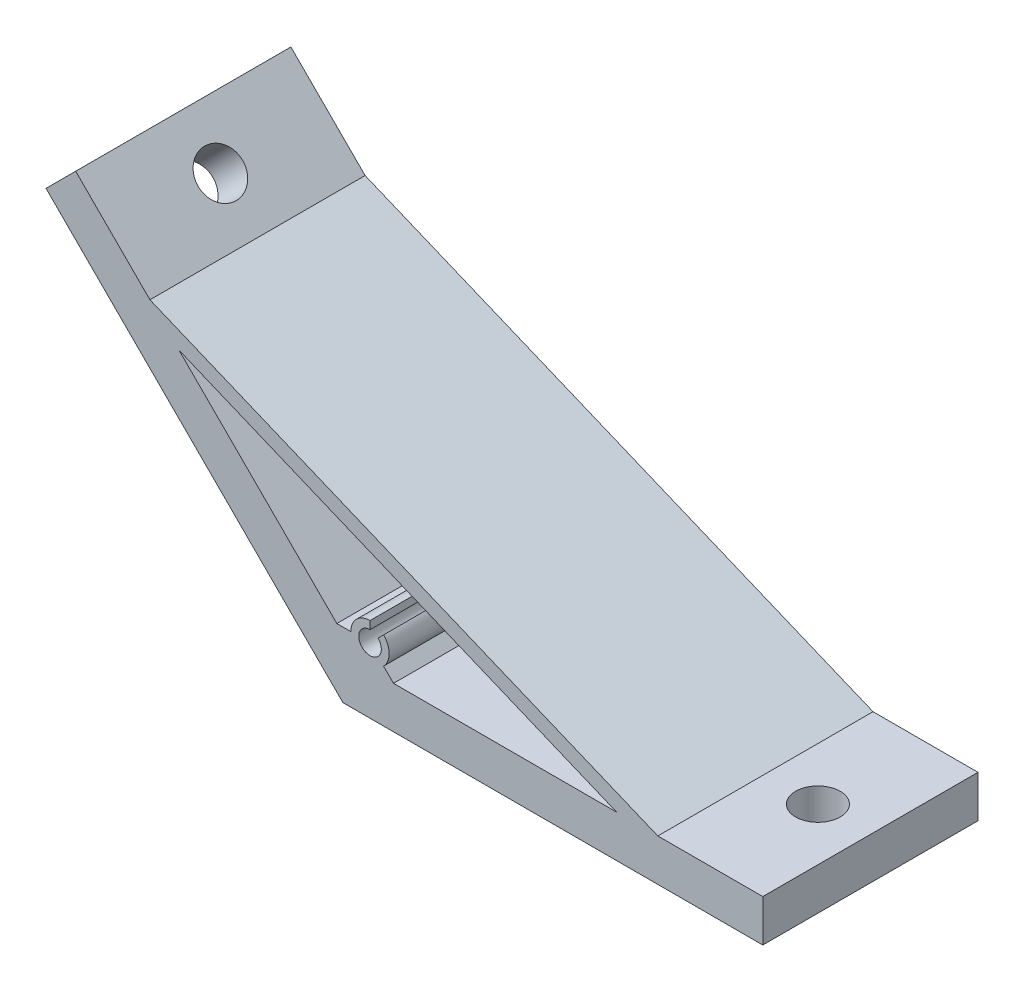
ISO-10303-21;
HEADER;
FILE_DESCRIPTION(('STEP AP214'),'2;1');
FILE_NAME('part.step','',(''),(''),'','','');
FILE_SCHEMA(('AUTOMOTIVE_DESIGN { 1 0 10303 214 1 1 1 1 }'));
ENDSEC;
DATA;
#1=APPLICATION_CONTEXT('core data for automotive mechanical design processes');
#2=APPLICATION_PROTOCOL_DEFINITION('international standard','automotive_design',2000,#1);
#3=PRODUCT_CONTEXT('',#1,'mechanical');
#4=PRODUCT('Part','Part','',(#3));
#5=PRODUCT_RELATED_PRODUCT_CATEGORY('part','',(#4));
#6=PRODUCT_DEFINITION_FORMATION('','',#4);
#7=PRODUCT_DEFINITION_CONTEXT('part definition',#1,'design');
#8=PRODUCT_DEFINITION('design','',#6,#7);
#9=PRODUCT_DEFINITION_SHAPE('','',#8);
#10=(LENGTH_UNIT() NAMED_UNIT(*) SI_UNIT(.MILLI.,.METRE.));
#11=(NAMED_UNIT(*) PLANE_ANGLE_UNIT() SI_UNIT($,.RADIAN.));
#12=(NAMED_UNIT(*) SI_UNIT($,.STERADIAN.) SOLID_ANGLE_UNIT());
#13=UNCERTAINTY_MEASURE_WITH_UNIT(LENGTH_MEASURE(1.E-05),#10,'distance_accuracy_value','');
#14=(GEOMETRIC_REPRESENTATION_CONTEXT(3) GLOBAL_UNCERTAINTY_ASSIGNED_CONTEXT((#13)) GLOBAL_UNIT_ASSIGNED_CONTEXT((#10,
#11,#12)) REPRESENTATION_CONTEXT('',''));
#15=CARTESIAN_POINT('',(0.,0.,0.));
#16=DIRECTION('',(0.,0.,1.));
#17=DIRECTION('',(1.,0.,0.));
#18=AXIS2_PLACEMENT_3D('',#15,#16,#17);
#19=CARTESIAN_POINT('',(-36.7695526216999,48.0832611206847,20.5));
#20=DIRECTION('',(-0.707106781186536,-0.707106781186559,0.));
#21=DIRECTION('',(0.707106781186559,-0.707106781186536,0.));
#22=AXIS2_PLACEMENT_3D('',#19,#20,#21);
#23=PLANE('',#22);
#24=DIRECTION('',(-0.707106781186559,0.707106781186536,0.));
#25=VECTOR('',#24,1.);
#26=CARTESIAN_POINT('',(-36.7695526216999,48.0832611206847,-20.5));
#27=LINE('',#26,#25);
#28=CARTESIAN_POINT('',(-36.7695526216999,48.0832611206847,-20.5));
#29=VERTEX_POINT('',#28);
#30=CARTESIAN_POINT('',(-50.9116882454318,62.2253967444162,-20.5));
#31=VERTEX_POINT('',#30);
#32=EDGE_CURVE('E259',#29,#31,#27,.T.);
#33=ORIENTED_EDGE('',*,*,#32,.T.);
#34=DIRECTION('',(0.,0.,-1.));
#35=VECTOR('',#34,1.);
#36=CARTESIAN_POINT('',(-50.9116882454318,62.2253967444162,20.5));
#37=LINE('',#36,#35);
#38=CARTESIAN_POINT('',(-50.9116882454318,62.2253967444162,20.5));
#39=VERTEX_POINT('',#38);
#40=EDGE_CURVE('E274',#39,#31,#37,.T.);
#41=ORIENTED_EDGE('',*,*,#40,.F.);
#42=DIRECTION('',(-0.707106781186559,0.707106781186536,0.));
#43=VECTOR('',#42,1.);
#44=CARTESIAN_POINT('',(-36.7695526216999,48.0832611206847,20.5));
#45=LINE('',#44,#43);
#46=CARTESIAN_POINT('',(-36.7695526216999,48.0832611206847,20.5));
#47=VERTEX_POINT('',#46);
#48=EDGE_CURVE('E244',#47,#39,#45,.T.);
#49=ORIENTED_EDGE('',*,*,#48,.F.);
#50=DIRECTION('',(0.,0.,-1.));
#51=VECTOR('',#50,1.);
#52=CARTESIAN_POINT('',(-36.7695526216999,48.0832611206847,20.5));
#53=LINE('',#52,#51);
#54=EDGE_CURVE('E277',#47,#29,#53,.T.);
#55=ORIENTED_EDGE('',*,*,#54,.T.);
#56=EDGE_LOOP('',(#33,#41,#49,#55));
#57=FACE_BOUND('',#56,.T.);
#58=CARTESIAN_POINT('',(-43.840620433566,55.1543289325507,0.));
#59=DIRECTION('',(-0.707106781186552,-0.707106781186543,0.));
#60=DIRECTION('',(0.707106781186543,-0.707106781186552,0.));
#61=AXIS2_PLACEMENT_3D('',#58,#59,#60);
#62=CIRCLE('',#61,4.25000000000001);
#63=CARTESIAN_POINT('',(-40.8354166135232,52.1491251125078,0.));
#64=VERTEX_POINT('',#63);
#65=EDGE_CURVE('E324',#64,#64,#62,.T.);
#66=ORIENTED_EDGE('',*,*,#65,.T.);
#67=EDGE_LOOP('',(#66));
#68=FACE_BOUND('',#67,.T.);
#69=ADVANCED_FACE('F34',(#57,#68),#23,.F.);
#70=CARTESIAN_POINT('',(0.,0.,20.5));
#71=DIRECTION('',(0.707106781186545,0.707106781186551,0.));
#72=DIRECTION('',(-0.70710678118655,0.707106781186545,0.));
#73=AXIS2_PLACEMENT_3D('',#70,#71,#72);
#74=PLANE('',#73);
#75=DIRECTION('',(0.70710678118655,-0.707106781186545,0.));
#76=VECTOR('',#75,1.);
#77=CARTESIAN_POINT('',(0.,0.,-20.5));
#78=LINE('',#77,#76);
#79=CARTESIAN_POINT('',(-56.5685424949243,56.5685424949238,-20.5));
#80=VERTEX_POINT('',#79);
#81=CARTESIAN_POINT('',(0.,0.,-20.5));
#82=VERTEX_POINT('',#81);
#83=EDGE_CURVE('E263',#80,#82,#78,.T.);
#84=ORIENTED_EDGE('',*,*,#83,.T.);
#85=DIRECTION('',(0.,0.,-1.));
#86=VECTOR('',#85,1.);
#87=CARTESIAN_POINT('',(0.,0.,20.5));
#88=LINE('',#87,#86);
#89=CARTESIAN_POINT('',(0.,0.,20.5));
#90=VERTEX_POINT('',#89);
#91=EDGE_CURVE('E268',#90,#82,#88,.T.);
#92=ORIENTED_EDGE('',*,*,#91,.F.);
#93=DIRECTION('',(0.70710678118655,-0.707106781186545,0.));
#94=VECTOR('',#93,1.);
#95=CARTESIAN_POINT('',(0.,0.,20.5));
#96=LINE('',#95,#94);
#97=CARTESIAN_POINT('',(-56.5685424949243,56.5685424949238,20.5));
#98=VERTEX_POINT('',#97);
#99=EDGE_CURVE('E248',#98,#90,#96,.T.);
#100=ORIENTED_EDGE('',*,*,#99,.F.);
#101=DIRECTION('',(0.,0.,-1.));
#102=VECTOR('',#101,1.);
#103=CARTESIAN_POINT('',(-56.5685424949243,56.5685424949238,20.5));
#104=LINE('',#103,#102);
#105=EDGE_CURVE('E271',#98,#80,#104,.T.);
#106=ORIENTED_EDGE('',*,*,#105,.T.);
#107=EDGE_LOOP('',(#84,#92,#100,#106));
#108=FACE_BOUND('',#107,.T.);
#109=CARTESIAN_POINT('',(-49.4974746830586,49.4974746830582,0.));
#110=DIRECTION('',(0.707106781186545,0.707106781186551,0.));
#111=DIRECTION('',(-0.70710678118655,0.707106781186545,0.));
#112=AXIS2_PLACEMENT_3D('',#109,#110,#111);
#113=CIRCLE('',#112,4.25000000000001);
#114=CARTESIAN_POINT('',(-52.5026785031014,52.502678503101,0.));
#115=VERTEX_POINT('',#114);
#116=EDGE_CURVE('E38',#115,#115,#113,.F.);
#117=ORIENTED_EDGE('',*,*,#116,.F.);
#118=EDGE_LOOP('',(#117));
#119=FACE_BOUND('',#118,.T.);
#120=ADVANCED_FACE('F316',(#108,#119),#74,.F.);
#121=CARTESIAN_POINT('',(0.,0.,20.5));
#122=DIRECTION('',(0.,0.,-1.));
#123=DIRECTION('',(-1.,0.,0.));
#124=AXIS2_PLACEMENT_3D('',#121,#122,#123);
#125=PLANE('',#124);
#126=DIRECTION('',(0.,1.,0.));
#127=VECTOR('',#126,1.);
#128=CARTESIAN_POINT('',(80.,8.,20.5));
#129=LINE('',#128,#127);
#130=CARTESIAN_POINT('',(80.,0.,20.5));
#131=VERTEX_POINT('',#130);
#132=CARTESIAN_POINT('',(80.,8.,20.5));
#133=VERTEX_POINT('',#132);
#134=EDGE_CURVE('E236',#131,#133,#129,.T.);
#135=ORIENTED_EDGE('',*,*,#134,.T.);
#136=DIRECTION('',(-1.,0.,0.));
#137=VECTOR('',#136,1.);
#138=CARTESIAN_POINT('',(80.,8.,20.5));
#139=LINE('',#138,#137);
#140=CARTESIAN_POINT('',(59.9999999999991,7.99999999999989,20.5));
#141=VERTEX_POINT('',#140);
#142=EDGE_CURVE('E239',#133,#141,#139,.T.);
#143=ORIENTED_EDGE('',*,*,#142,.T.);
#144=DIRECTION('',(-0.923879532511286,0.382683432365092,0.));
#145=VECTOR('',#144,1.);
#146=CARTESIAN_POINT('',(-36.7695526216999,48.0832611206847,20.5));
#147=LINE('',#146,#145);
#148=EDGE_CURVE('E242',#141,#47,#147,.T.);
#149=ORIENTED_EDGE('',*,*,#148,.T.);
#150=ORIENTED_EDGE('',*,*,#48,.T.);
#151=DIRECTION('',(-0.707106781186548,-0.707106781186548,0.));
#152=VECTOR('',#151,1.);
#153=CARTESIAN_POINT('',(-50.9116882454318,62.2253967444162,20.5));
#154=LINE('',#153,#152);
#155=EDGE_CURVE('E246',#39,#98,#154,.T.);
#156=ORIENTED_EDGE('',*,*,#155,.T.);
#157=ORIENTED_EDGE('',*,*,#99,.T.);
#158=DIRECTION('',(1.,0.,0.));
#159=VECTOR('',#158,1.);
#160=CARTESIAN_POINT('',(80.,0.,20.5));
#161=LINE('',#160,#159);
#162=EDGE_CURVE('E250',#90,#131,#161,.T.);
#163=ORIENTED_EDGE('',*,*,#162,.T.);
#164=EDGE_LOOP('',(#135,#143,#149,#150,#156,#157,#163));
#165=FACE_BOUND('',#164,.T.);
#166=DIRECTION('',(-0.92387953251129,0.382683432365082,0.));
#167=VECTOR('',#166,1.);
#168=CARTESIAN_POINT('',(-31.2262754266308,42.5399839256161,20.5));
#169=LINE('',#168,#167);
#170=CARTESIAN_POINT('',(52.1606222107425,7.99999999999989,20.5));
#171=VERTEX_POINT('',#170);
#172=CARTESIAN_POINT('',(-31.2262754266308,42.5399839256161,20.5));
#173=VERTEX_POINT('',#172);
#174=EDGE_CURVE('E154',#171,#173,#169,.T.);
#175=ORIENTED_EDGE('',*,*,#174,.F.);
#176=DIRECTION('',(1.,0.,0.));
#177=VECTOR('',#176,1.);
#178=CARTESIAN_POINT('',(52.1606222107425,7.99999999999989,20.5));
#179=LINE('',#178,#177);
#180=CARTESIAN_POINT('',(9.63860002583124,8.,20.5));
#181=VERTEX_POINT('',#180);
#182=EDGE_CURVE('E193',#181,#171,#179,.T.);
#183=ORIENTED_EDGE('',*,*,#182,.F.);
#184=DIRECTION('',(0.70710678118647,-0.707106781186625,0.));
#185=VECTOR('',#184,1.);
#186=CARTESIAN_POINT('',(9.63860002583124,8.,20.5));
#187=LINE('',#186,#185);
#188=CARTESIAN_POINT('',(7.74716608826006,9.89143393757159,20.5));
#189=VERTEX_POINT('',#188);
#190=EDGE_CURVE('E191',#189,#181,#187,.T.);
#191=ORIENTED_EDGE('',*,*,#190,.F.);
#192=CARTESIAN_POINT('',(5.16622633692896,12.4723736889023,20.5));
#193=DIRECTION('',(0.,0.,-1.));
#194=DIRECTION('',(1.,0.,0.));
#195=AXIS2_PLACEMENT_3D('',#192,#193,#194);
#196=CIRCLE('',#195,3.65);
#197=CARTESIAN_POINT('',(7.74716608826007,15.053313440233,20.5));
#198=VERTEX_POINT('',#197);
#199=EDGE_CURVE('E189',#198,#189,#196,.T.);
#200=ORIENTED_EDGE('',*,*,#199,.F.);
#201=DIRECTION('',(0.707106781186523,0.707106781186572,0.));
#202=VECTOR('',#201,1.);
#203=CARTESIAN_POINT('',(6.68650591648028,13.9926532684531,20.5));
#204=LINE('',#203,#202);
#205=CARTESIAN_POINT('',(6.68650591648028,13.9926532684531,20.5));
#206=VERTEX_POINT('',#205);
#207=EDGE_CURVE('E187',#206,#198,#204,.T.);
#208=ORIENTED_EDGE('',*,*,#207,.F.);
#209=CARTESIAN_POINT('',(5.16622633692896,12.4723736889023,20.5));
#210=DIRECTION('',(0.,0.,1.));
#211=DIRECTION('',(1.,0.,0.));
#212=AXIS2_PLACEMENT_3D('',#209,#210,#211);
#213=CIRCLE('',#212,2.15);
#214=CARTESIAN_POINT('',(5.16622633692896,14.6223736889023,20.5));
#215=VERTEX_POINT('',#214);
#216=EDGE_CURVE('E185',#215,#206,#213,.T.);
#217=ORIENTED_EDGE('',*,*,#216,.F.);
#218=DIRECTION('',(0.,-1.,0.));
#219=VECTOR('',#218,1.);
#220=CARTESIAN_POINT('',(5.16622633692896,14.6223736889023,20.5));
#221=LINE('',#220,#219);
#222=CARTESIAN_POINT('',(5.16622633692896,16.1223736889023,20.5));
#223=VERTEX_POINT('',#222);
#224=EDGE_CURVE('E183',#223,#215,#221,.T.);
#225=ORIENTED_EDGE('',*,*,#224,.F.);
#226=CARTESIAN_POINT('',(5.16622633692896,12.4723736889023,20.5));
#227=DIRECTION('',(0.,0.,-1.));
#228=DIRECTION('',(1.,0.,0.));
#229=AXIS2_PLACEMENT_3D('',#226,#227,#228);
#230=CIRCLE('',#229,3.65);
#231=CARTESIAN_POINT('',(1.51622633692896,12.4723736889023,20.5));
#232=VERTEX_POINT('',#231);
#233=EDGE_CURVE('E178',#232,#223,#230,.T.);
#234=ORIENTED_EDGE('',*,*,#233,.F.);
#235=DIRECTION('',(1.,0.,0.));
#236=VECTOR('',#235,1.);
#237=CARTESIAN_POINT('',(-1.15866518991743,12.4723736889023,20.5));
#238=LINE('',#237,#236);
#239=CARTESIAN_POINT('',(-1.15866518991743,12.4723736889023,20.5));
#240=VERTEX_POINT('',#239);
#241=EDGE_CURVE('E176',#240,#232,#238,.T.);
#242=ORIENTED_EDGE('',*,*,#241,.F.);
#243=DIRECTION('',(0.707106781186542,-0.707106781186553,0.));
#244=VECTOR('',#243,1.);
#245=CARTESIAN_POINT('',(-1.15866518991743,12.4723736889023,20.5));
#246=LINE('',#245,#244);
#247=EDGE_CURVE('E162',#173,#240,#246,.T.);
#248=ORIENTED_EDGE('',*,*,#247,.F.);
#249=EDGE_LOOP('',(#175,#183,#191,#200,#208,#217,#225,#234,#242,#248));
#250=FACE_BOUND('',#249,.T.);
#251=ADVANCED_FACE('F174',(#165,#250),#125,.F.);
#252=CARTESIAN_POINT('',(0.,0.,-20.5));
#253=DIRECTION('',(0.,0.,-1.));
#254=DIRECTION('',(-1.,0.,0.));
#255=AXIS2_PLACEMENT_3D('',#252,#253,#254);
#256=PLANE('',#255);
#257=DIRECTION('',(0.,1.,0.));
#258=VECTOR('',#257,1.);
#259=CARTESIAN_POINT('',(80.,8.,-20.5));
#260=LINE('',#259,#258);
#261=CARTESIAN_POINT('',(80.,0.,-20.5));
#262=VERTEX_POINT('',#261);
#263=CARTESIAN_POINT('',(80.,8.,-20.5));
#264=VERTEX_POINT('',#263);
#265=EDGE_CURVE('E170',#262,#264,#260,.T.);
#266=ORIENTED_EDGE('',*,*,#265,.F.);
#267=DIRECTION('',(1.,0.,0.));
#268=VECTOR('',#267,1.);
#269=CARTESIAN_POINT('',(80.,0.,-20.5));
#270=LINE('',#269,#268);
#271=EDGE_CURVE('E240',#82,#262,#270,.T.);
#272=ORIENTED_EDGE('',*,*,#271,.F.);
#273=ORIENTED_EDGE('',*,*,#83,.F.);
#274=DIRECTION('',(-0.707106781186548,-0.707106781186548,0.));
#275=VECTOR('',#274,1.);
#276=CARTESIAN_POINT('',(-50.9116882454318,62.2253967444162,-20.5));
#277=LINE('',#276,#275);
#278=EDGE_CURVE('E261',#31,#80,#277,.T.);
#279=ORIENTED_EDGE('',*,*,#278,.F.);
#280=ORIENTED_EDGE('',*,*,#32,.F.);
#281=DIRECTION('',(-0.923879532511286,0.382683432365092,0.));
#282=VECTOR('',#281,1.);
#283=CARTESIAN_POINT('',(-36.7695526216999,48.0832611206847,-20.5));
#284=LINE('',#283,#282);
#285=CARTESIAN_POINT('',(59.9999999999991,7.99999999999989,-20.5));
#286=VERTEX_POINT('',#285);
#287=EDGE_CURVE('E257',#286,#29,#284,.T.);
#288=ORIENTED_EDGE('',*,*,#287,.F.);
#289=DIRECTION('',(-1.,0.,0.));
#290=VECTOR('',#289,1.);
#291=CARTESIAN_POINT('',(80.,8.,-20.5));
#292=LINE('',#291,#290);
#293=EDGE_CURVE('E255',#264,#286,#292,.T.);
#294=ORIENTED_EDGE('',*,*,#293,.F.);
#295=EDGE_LOOP('',(#266,#272,#273,#279,#280,#288,#294));
#296=FACE_BOUND('',#295,.T.);
#297=DIRECTION('',(1.,0.,0.));
#298=VECTOR('',#297,1.);
#299=CARTESIAN_POINT('',(52.1606222107425,7.99999999999989,-20.5));
#300=LINE('',#299,#298);
#301=CARTESIAN_POINT('',(9.63860002583124,8.,-20.5));
#302=VERTEX_POINT('',#301);
#303=CARTESIAN_POINT('',(52.1606222107425,7.99999999999989,-20.5));
#304=VERTEX_POINT('',#303);
#305=EDGE_CURVE('E163',#302,#304,#300,.T.);
#306=ORIENTED_EDGE('',*,*,#305,.T.);
#307=DIRECTION('',(-0.92387953251129,0.382683432365082,0.));
#308=VECTOR('',#307,1.);
#309=CARTESIAN_POINT('',(-31.2262754266308,42.5399839256161,-20.5));
#310=LINE('',#309,#308);
#311=CARTESIAN_POINT('',(-31.2262754266308,42.5399839256161,-20.5));
#312=VERTEX_POINT('',#311);
#313=EDGE_CURVE('E58',#304,#312,#310,.T.);
#314=ORIENTED_EDGE('',*,*,#313,.T.);
#315=DIRECTION('',(0.707106781186542,-0.707106781186553,0.));
#316=VECTOR('',#315,1.);
#317=CARTESIAN_POINT('',(-1.15866518991743,12.4723736889023,-20.5));
#318=LINE('',#317,#316);
#319=CARTESIAN_POINT('',(-1.15866518991743,12.4723736889023,-20.5));
#320=VERTEX_POINT('',#319);
#321=EDGE_CURVE('E169',#312,#320,#318,.T.);
#322=ORIENTED_EDGE('',*,*,#321,.T.);
#323=DIRECTION('',(1.,0.,0.));
#324=VECTOR('',#323,1.);
#325=CARTESIAN_POINT('',(-1.15866518991743,12.4723736889023,-20.5));
#326=LINE('',#325,#324);
#327=CARTESIAN_POINT('',(1.51622633692896,12.4723736889023,-20.5));
#328=VERTEX_POINT('',#327);
#329=EDGE_CURVE('E198',#320,#328,#326,.T.);
#330=ORIENTED_EDGE('',*,*,#329,.T.);
#331=CARTESIAN_POINT('',(5.16622633692896,12.4723736889023,-20.5));
#332=DIRECTION('',(0.,0.,-1.));
#333=DIRECTION('',(1.,0.,0.));
#334=AXIS2_PLACEMENT_3D('',#331,#332,#333);
#335=CIRCLE('',#334,3.65);
#336=CARTESIAN_POINT('',(5.16622633692896,16.1223736889023,-20.5));
#337=VERTEX_POINT('',#336);
#338=EDGE_CURVE('E201',#328,#337,#335,.T.);
#339=ORIENTED_EDGE('',*,*,#338,.T.);
#340=DIRECTION('',(0.,-1.,0.));
#341=VECTOR('',#340,1.);
#342=CARTESIAN_POINT('',(5.16622633692896,14.6223736889023,-20.5));
#343=LINE('',#342,#341);
#344=CARTESIAN_POINT('',(5.16622633692896,14.6223736889023,-20.5));
#345=VERTEX_POINT('',#344);
#346=EDGE_CURVE('E204',#337,#345,#343,.T.);
#347=ORIENTED_EDGE('',*,*,#346,.T.);
#348=CARTESIAN_POINT('',(5.16622633692896,12.4723736889023,-20.5));
#349=DIRECTION('',(0.,0.,1.));
#350=DIRECTION('',(1.,0.,0.));
#351=AXIS2_PLACEMENT_3D('',#348,#349,#350);
#352=CIRCLE('',#351,2.15);
#353=CARTESIAN_POINT('',(6.68650591648028,13.9926532684531,-20.5));
#354=VERTEX_POINT('',#353);
#355=EDGE_CURVE('E207',#345,#354,#352,.T.);
#356=ORIENTED_EDGE('',*,*,#355,.T.);
#357=DIRECTION('',(0.707106781186523,0.707106781186572,0.));
#358=VECTOR('',#357,1.);
#359=CARTESIAN_POINT('',(6.68650591648028,13.9926532684531,-20.5));
#360=LINE('',#359,#358);
#361=CARTESIAN_POINT('',(7.74716608826007,15.053313440233,-20.5));
#362=VERTEX_POINT('',#361);
#363=EDGE_CURVE('E210',#354,#362,#360,.T.);
#364=ORIENTED_EDGE('',*,*,#363,.T.);
#365=CARTESIAN_POINT('',(5.16622633692896,12.4723736889023,-20.5));
#366=DIRECTION('',(0.,0.,-1.));
#367=DIRECTION('',(1.,0.,0.));
#368=AXIS2_PLACEMENT_3D('',#365,#366,#367);
#369=CIRCLE('',#368,3.65);
#370=CARTESIAN_POINT('',(7.74716608826006,9.89143393757159,-20.5));
#371=VERTEX_POINT('',#370);
#372=EDGE_CURVE('E213',#362,#371,#369,.T.);
#373=ORIENTED_EDGE('',*,*,#372,.T.);
#374=DIRECTION('',(0.70710678118647,-0.707106781186625,0.));
#375=VECTOR('',#374,1.);
#376=CARTESIAN_POINT('',(9.63860002583124,8.,-20.5));
#377=LINE('',#376,#375);
#378=EDGE_CURVE('E216',#371,#302,#377,.T.);
#379=ORIENTED_EDGE('',*,*,#378,.T.);
#380=EDGE_LOOP('',(#306,#314,#322,#330,#339,#347,#356,#364,#373,#379));
#381=FACE_BOUND('',#380,.T.);
#382=ADVANCED_FACE('F291',(#296,#381),#256,.T.);
#383=CARTESIAN_POINT('',(80.,8.,20.5));
#384=DIRECTION('',(-1.,0.,0.));
#385=DIRECTION('',(0.,0.,1.));
#386=AXIS2_PLACEMENT_3D('',#383,#384,#385);
#387=PLANE('',#386);
#388=ORIENTED_EDGE('',*,*,#265,.T.);
#389=DIRECTION('',(0.,0.,-1.));
#390=VECTOR('',#389,1.);
#391=CARTESIAN_POINT('',(80.,8.,20.5));
#392=LINE('',#391,#390);
#393=EDGE_CURVE('E11',#133,#264,#392,.T.);
#394=ORIENTED_EDGE('',*,*,#393,.F.);
#395=ORIENTED_EDGE('',*,*,#134,.F.);
#396=DIRECTION('',(0.,0.,-1.));
#397=VECTOR('',#396,1.);
#398=CARTESIAN_POINT('',(80.,0.,20.5));
#399=LINE('',#398,#397);
#400=EDGE_CURVE('E252',#131,#262,#399,.T.);
#401=ORIENTED_EDGE('',*,*,#400,.T.);
#402=EDGE_LOOP('',(#388,#394,#395,#401));
#403=FACE_BOUND('',#402,.T.);
#404=ADVANCED_FACE('F36',(#403),#387,.F.);
#405=CARTESIAN_POINT('',(80.,8.,20.5));
#406=DIRECTION('',(0.,-1.,0.));
#407=DIRECTION('',(1.,0.,0.));
#408=AXIS2_PLACEMENT_3D('',#405,#406,#407);
#409=PLANE('',#408);
#410=CARTESIAN_POINT('',(70.,7.99999999999994,0.));
#411=DIRECTION('',(0.,1.,0.));
#412=DIRECTION('',(-1.,0.,0.));
#413=AXIS2_PLACEMENT_3D('',#410,#411,#412);
#414=CIRCLE('',#413,4.25000000000001);
#415=CARTESIAN_POINT('',(65.75,7.99999999999992,0.));
#416=VERTEX_POINT('',#415);
#417=EDGE_CURVE('E323',#416,#416,#414,.T.);
#418=ORIENTED_EDGE('',*,*,#417,.F.);
#419=EDGE_LOOP('',(#418));
#420=FACE_BOUND('',#419,.T.);
#421=ORIENTED_EDGE('',*,*,#293,.T.);
#422=DIRECTION('',(0.,0.,-1.));
#423=VECTOR('',#422,1.);
#424=CARTESIAN_POINT('',(59.9999999999991,7.99999999999989,20.5));
#425=LINE('',#424,#423);
#426=EDGE_CURVE('E43',#141,#286,#425,.T.);
#427=ORIENTED_EDGE('',*,*,#426,.F.);
#428=ORIENTED_EDGE('',*,*,#142,.F.);
#429=ORIENTED_EDGE('',*,*,#393,.T.);
#430=EDGE_LOOP('',(#421,#427,#428,#429));
#431=FACE_BOUND('',#430,.T.);
#432=ADVANCED_FACE('F308',(#420,#431),#409,.F.);
#433=CARTESIAN_POINT('',(-36.7695526216999,48.0832611206847,20.5));
#434=DIRECTION('',(-0.382683432365092,-0.923879532511286,0.));
#435=DIRECTION('',(0.923879532511286,-0.382683432365092,0.));
#436=AXIS2_PLACEMENT_3D('',#433,#434,#435);
#437=PLANE('',#436);
#438=ORIENTED_EDGE('',*,*,#287,.T.);
#439=ORIENTED_EDGE('',*,*,#54,.F.);
#440=ORIENTED_EDGE('',*,*,#148,.F.);
#441=ORIENTED_EDGE('',*,*,#426,.T.);
#442=EDGE_LOOP('',(#438,#439,#440,#441));
#443=FACE_BOUND('',#442,.T.);
#444=ADVANCED_FACE('F285',(#443),#437,.F.);
#445=CARTESIAN_POINT('',(-50.9116882454318,62.2253967444162,20.5));
#446=DIRECTION('',(0.707106781186547,-0.707106781186547,0.));
#447=DIRECTION('',(0.707106781186548,0.707106781186548,0.));
#448=AXIS2_PLACEMENT_3D('',#445,#446,#447);
#449=PLANE('',#448);
#450=ORIENTED_EDGE('',*,*,#278,.T.);
#451=ORIENTED_EDGE('',*,*,#105,.F.);
#452=ORIENTED_EDGE('',*,*,#155,.F.);
#453=ORIENTED_EDGE('',*,*,#40,.T.);
#454=EDGE_LOOP('',(#450,#451,#452,#453));
#455=FACE_BOUND('',#454,.T.);
#456=ADVANCED_FACE('F301',(#455),#449,.F.);
#457=CARTESIAN_POINT('',(80.,0.,20.5));
#458=DIRECTION('',(0.,1.,0.));
#459=DIRECTION('',(0.,0.,1.));
#460=AXIS2_PLACEMENT_3D('',#457,#458,#459);
#461=PLANE('',#460);
#462=CARTESIAN_POINT('',(70.,0.,0.));
#463=DIRECTION('',(0.,1.,0.));
#464=DIRECTION('',(-1.,0.,0.));
#465=AXIS2_PLACEMENT_3D('',#462,#463,#464);
#466=CIRCLE('',#465,4.25000000000001);
#467=CARTESIAN_POINT('',(65.75,0.,0.));
#468=VERTEX_POINT('',#467);
#469=EDGE_CURVE('E196',#468,#468,#466,.T.);
#470=ORIENTED_EDGE('',*,*,#469,.T.);
#471=EDGE_LOOP('',(#470));
#472=FACE_BOUND('',#471,.T.);
#473=ORIENTED_EDGE('',*,*,#271,.T.);
#474=ORIENTED_EDGE('',*,*,#400,.F.);
#475=ORIENTED_EDGE('',*,*,#162,.F.);
#476=ORIENTED_EDGE('',*,*,#91,.T.);
#477=EDGE_LOOP('',(#473,#474,#475,#476));
#478=FACE_BOUND('',#477,.T.);
#479=ADVANCED_FACE('F313',(#472,#478),#461,.F.);
#480=CARTESIAN_POINT('',(-31.2262754266308,42.5399839256161,20.5));
#481=DIRECTION('',(-0.382683432365082,-0.92387953251129,0.));
#482=DIRECTION('',(0.92387953251129,-0.382683432365082,0.));
#483=AXIS2_PLACEMENT_3D('',#480,#481,#482);
#484=PLANE('',#483);
#485=ORIENTED_EDGE('',*,*,#313,.F.);
#486=DIRECTION('',(0.,0.,-1.));
#487=VECTOR('',#486,1.);
#488=CARTESIAN_POINT('',(52.1606222107425,7.99999999999989,20.5));
#489=LINE('',#488,#487);
#490=EDGE_CURVE('E158',#171,#304,#489,.T.);
#491=ORIENTED_EDGE('',*,*,#490,.F.);
#492=ORIENTED_EDGE('',*,*,#174,.T.);
#493=DIRECTION('',(0.,0.,-1.));
#494=VECTOR('',#493,1.);
#495=CARTESIAN_POINT('',(-31.2262754266308,42.5399839256161,20.5));
#496=LINE('',#495,#494);
#497=EDGE_CURVE('E157',#173,#312,#496,.T.);
#498=ORIENTED_EDGE('',*,*,#497,.T.);
#499=EDGE_LOOP('',(#485,#491,#492,#498));
#500=FACE_BOUND('',#499,.T.);
#501=ADVANCED_FACE('F156',(#500),#484,.T.);
#502=CARTESIAN_POINT('',(-1.15866518991743,12.4723736889023,20.5));
#503=DIRECTION('',(0.707106781186553,0.707106781186542,0.));
#504=DIRECTION('',(-0.707106781186542,0.707106781186553,0.));
#505=AXIS2_PLACEMENT_3D('',#502,#503,#504);
#506=PLANE('',#505);
#507=ORIENTED_EDGE('',*,*,#321,.F.);
#508=ORIENTED_EDGE('',*,*,#497,.F.);
#509=ORIENTED_EDGE('',*,*,#247,.T.);
#510=DIRECTION('',(0.,0.,-1.));
#511=VECTOR('',#510,1.);
#512=CARTESIAN_POINT('',(-1.15866518991743,12.4723736889023,20.5));
#513=LINE('',#512,#511);
#514=EDGE_CURVE('E171',#240,#320,#513,.T.);
#515=ORIENTED_EDGE('',*,*,#514,.T.);
#516=EDGE_LOOP('',(#507,#508,#509,#515));
#517=FACE_BOUND('',#516,.T.);
#518=ADVANCED_FACE('F166',(#517),#506,.T.);
#519=CARTESIAN_POINT('',(-1.15866518991743,12.4723736889023,20.5));
#520=DIRECTION('',(0.,1.,0.));
#521=DIRECTION('',(0.,0.,1.));
#522=AXIS2_PLACEMENT_3D('',#519,#520,#521);
#523=PLANE('',#522);
#524=ORIENTED_EDGE('',*,*,#329,.F.);
#525=ORIENTED_EDGE('',*,*,#514,.F.);
#526=ORIENTED_EDGE('',*,*,#241,.T.);
#527=DIRECTION('',(0.,0.,-1.));
#528=VECTOR('',#527,1.);
#529=CARTESIAN_POINT('',(1.51622633692896,12.4723736889023,20.5));
#530=LINE('',#529,#528);
#531=EDGE_CURVE('E233',#232,#328,#530,.T.);
#532=ORIENTED_EDGE('',*,*,#531,.T.);
#533=EDGE_LOOP('',(#524,#525,#526,#532));
#534=FACE_BOUND('',#533,.T.);
#535=ADVANCED_FACE('F365',(#534),#523,.T.);
#536=CARTESIAN_POINT('',(5.16622633692896,12.4723736889023,20.5));
#537=DIRECTION('',(0.,0.,-1.));
#538=DIRECTION('',(-1.,0.,0.));
#539=AXIS2_PLACEMENT_3D('',#536,#537,#538);
#540=CYLINDRICAL_SURFACE('',#539,3.65);
#541=ORIENTED_EDGE('',*,*,#338,.F.);
#542=ORIENTED_EDGE('',*,*,#531,.F.);
#543=ORIENTED_EDGE('',*,*,#233,.T.);
#544=DIRECTION('',(0.,0.,-1.));
#545=VECTOR('',#544,1.);
#546=CARTESIAN_POINT('',(5.16622633692896,16.1223736889023,20.5));
#547=LINE('',#546,#545);
#548=EDGE_CURVE('E231',#223,#337,#547,.T.);
#549=ORIENTED_EDGE('',*,*,#548,.T.);
#550=EDGE_LOOP('',(#541,#542,#543,#549));
#551=FACE_BOUND('',#550,.T.);
#552=ADVANCED_FACE('F368',(#551),#540,.T.);
#553=CARTESIAN_POINT('',(5.16622633692896,14.6223736889023,20.5));
#554=DIRECTION('',(1.,0.,0.));
#555=DIRECTION('',(0.,0.,-1.));
#556=AXIS2_PLACEMENT_3D('',#553,#554,#555);
#557=PLANE('',#556);
#558=ORIENTED_EDGE('',*,*,#346,.F.);
#559=ORIENTED_EDGE('',*,*,#548,.F.);
#560=ORIENTED_EDGE('',*,*,#224,.T.);
#561=DIRECTION('',(0.,0.,-1.));
#562=VECTOR('',#561,1.);
#563=CARTESIAN_POINT('',(5.16622633692896,14.6223736889023,20.5));
#564=LINE('',#563,#562);
#565=EDGE_CURVE('E229',#215,#345,#564,.T.);
#566=ORIENTED_EDGE('',*,*,#565,.T.);
#567=EDGE_LOOP('',(#558,#559,#560,#566));
#568=FACE_BOUND('',#567,.T.);
#569=ADVANCED_FACE('F372',(#568),#557,.T.);
#570=CARTESIAN_POINT('',(5.16622633692896,12.4723736889023,20.5));
#571=DIRECTION('',(0.,0.,-1.));
#572=DIRECTION('',(-1.,0.,0.));
#573=AXIS2_PLACEMENT_3D('',#570,#571,#572);
#574=CYLINDRICAL_SURFACE('',#573,2.15);
#575=ORIENTED_EDGE('',*,*,#355,.F.);
#576=ORIENTED_EDGE('',*,*,#565,.F.);
#577=ORIENTED_EDGE('',*,*,#216,.T.);
#578=DIRECTION('',(0.,0.,-1.));
#579=VECTOR('',#578,1.);
#580=CARTESIAN_POINT('',(6.68650591648028,13.9926532684531,20.5));
#581=LINE('',#580,#579);
#582=EDGE_CURVE('E227',#206,#354,#581,.T.);
#583=ORIENTED_EDGE('',*,*,#582,.T.);
#584=EDGE_LOOP('',(#575,#576,#577,#583));
#585=FACE_BOUND('',#584,.T.);
#586=ADVANCED_FACE('F376',(#585),#574,.F.);
#587=CARTESIAN_POINT('',(6.68650591648028,13.9926532684531,20.5));
#588=DIRECTION('',(-0.707106781186572,0.707106781186523,0.));
#589=DIRECTION('',(-0.707106781186523,-0.707106781186572,0.));
#590=AXIS2_PLACEMENT_3D('',#587,#588,#589);
#591=PLANE('',#590);
#592=ORIENTED_EDGE('',*,*,#363,.F.);
#593=ORIENTED_EDGE('',*,*,#582,.F.);
#594=ORIENTED_EDGE('',*,*,#207,.T.);
#595=DIRECTION('',(0.,0.,-1.));
#596=VECTOR('',#595,1.);
#597=CARTESIAN_POINT('',(7.74716608826007,15.053313440233,20.5));
#598=LINE('',#597,#596);
#599=EDGE_CURVE('E225',#198,#362,#598,.T.);
#600=ORIENTED_EDGE('',*,*,#599,.T.);
#601=EDGE_LOOP('',(#592,#593,#594,#600));
#602=FACE_BOUND('',#601,.T.);
#603=ADVANCED_FACE('F380',(#602),#591,.T.);
#604=CARTESIAN_POINT('',(5.16622633692896,12.4723736889023,20.5));
#605=DIRECTION('',(0.,0.,-1.));
#606=DIRECTION('',(-1.,0.,0.));
#607=AXIS2_PLACEMENT_3D('',#604,#605,#606);
#608=CYLINDRICAL_SURFACE('',#607,3.65);
#609=ORIENTED_EDGE('',*,*,#372,.F.);
#610=ORIENTED_EDGE('',*,*,#599,.F.);
#611=ORIENTED_EDGE('',*,*,#199,.T.);
#612=DIRECTION('',(0.,0.,-1.));
#613=VECTOR('',#612,1.);
#614=CARTESIAN_POINT('',(7.74716608826006,9.89143393757159,20.5));
#615=LINE('',#614,#613);
#616=EDGE_CURVE('E223',#189,#371,#615,.T.);
#617=ORIENTED_EDGE('',*,*,#616,.T.);
#618=EDGE_LOOP('',(#609,#610,#611,#617));
#619=FACE_BOUND('',#618,.T.);
#620=ADVANCED_FACE('F384',(#619),#608,.T.);
#621=CARTESIAN_POINT('',(9.63860002583124,8.,20.5));
#622=DIRECTION('',(0.707106781186625,0.70710678118647,0.));
#623=DIRECTION('',(-0.70710678118647,0.707106781186625,0.));
#624=AXIS2_PLACEMENT_3D('',#621,#622,#623);
#625=PLANE('',#624);
#626=ORIENTED_EDGE('',*,*,#378,.F.);
#627=ORIENTED_EDGE('',*,*,#616,.F.);
#628=ORIENTED_EDGE('',*,*,#190,.T.);
#629=DIRECTION('',(0.,0.,-1.));
#630=VECTOR('',#629,1.);
#631=CARTESIAN_POINT('',(9.63860002583124,8.,20.5));
#632=LINE('',#631,#630);
#633=EDGE_CURVE('E50',#181,#302,#632,.T.);
#634=ORIENTED_EDGE('',*,*,#633,.T.);
#635=EDGE_LOOP('',(#626,#627,#628,#634));
#636=FACE_BOUND('',#635,.T.);
#637=ADVANCED_FACE('F388',(#636),#625,.T.);
#638=CARTESIAN_POINT('',(52.1606222107425,7.99999999999989,20.5));
#639=DIRECTION('',(0.,1.,0.));
#640=DIRECTION('',(-1.,0.,0.));
#641=AXIS2_PLACEMENT_3D('',#638,#639,#640);
#642=PLANE('',#641);
#643=ORIENTED_EDGE('',*,*,#305,.F.);
#644=ORIENTED_EDGE('',*,*,#633,.F.);
#645=ORIENTED_EDGE('',*,*,#182,.T.);
#646=ORIENTED_EDGE('',*,*,#490,.T.);
#647=EDGE_LOOP('',(#643,#644,#645,#646));
#648=FACE_BOUND('',#647,.T.);
#649=ADVANCED_FACE('F338',(#648),#642,.T.);
#650=CARTESIAN_POINT('',(70.,0.,0.));
#651=DIRECTION('',(0.,1.,0.));
#652=DIRECTION('',(-1.,0.,0.));
#653=AXIS2_PLACEMENT_3D('',#650,#651,#652);
#654=CYLINDRICAL_SURFACE('',#653,4.25000000000001);
#655=ORIENTED_EDGE('',*,*,#469,.F.);
#656=EDGE_LOOP('',(#655));
#657=FACE_BOUND('',#656,.T.);
#658=ORIENTED_EDGE('',*,*,#417,.T.);
#659=EDGE_LOOP('',(#658));
#660=FACE_BOUND('',#659,.T.);
#661=ADVANCED_FACE('F334',(#657,#660),#654,.F.);
#662=CARTESIAN_POINT('',(-77.7817459305206,21.2132034355965,0.));
#663=DIRECTION('',(0.707106781186552,0.707106781186544,0.));
#664=DIRECTION('',(-0.707106781186544,0.707106781186552,0.));
#665=AXIS2_PLACEMENT_3D('',#662,#663,#664);
#666=CYLINDRICAL_SURFACE('',#665,4.25000000000001);
#667=ORIENTED_EDGE('',*,*,#65,.F.);
#668=EDGE_LOOP('',(#667));
#669=FACE_BOUND('',#668,.T.);
#670=ORIENTED_EDGE('',*,*,#116,.T.);
#671=EDGE_LOOP('',(#670));
#672=FACE_BOUND('',#671,.T.);
#673=ADVANCED_FACE('F337',(#669,#672),#666,.F.);
#674=CLOSED_SHELL('',(#69,#120,#251,#382,#404,#432,#444,#456,#479,#501,#518,#535,#552,#569,#586,
#603,#620,#637,#649,#661,#673));
#675=MANIFOLD_SOLID_BREP('B2',#674);
#676=ADVANCED_BREP_SHAPE_REPRESENTATION('',(#18,#675),#14);
#677=SHAPE_DEFINITION_REPRESENTATION(#9,#676);
ENDSEC;
END-ISO-10303-21;
